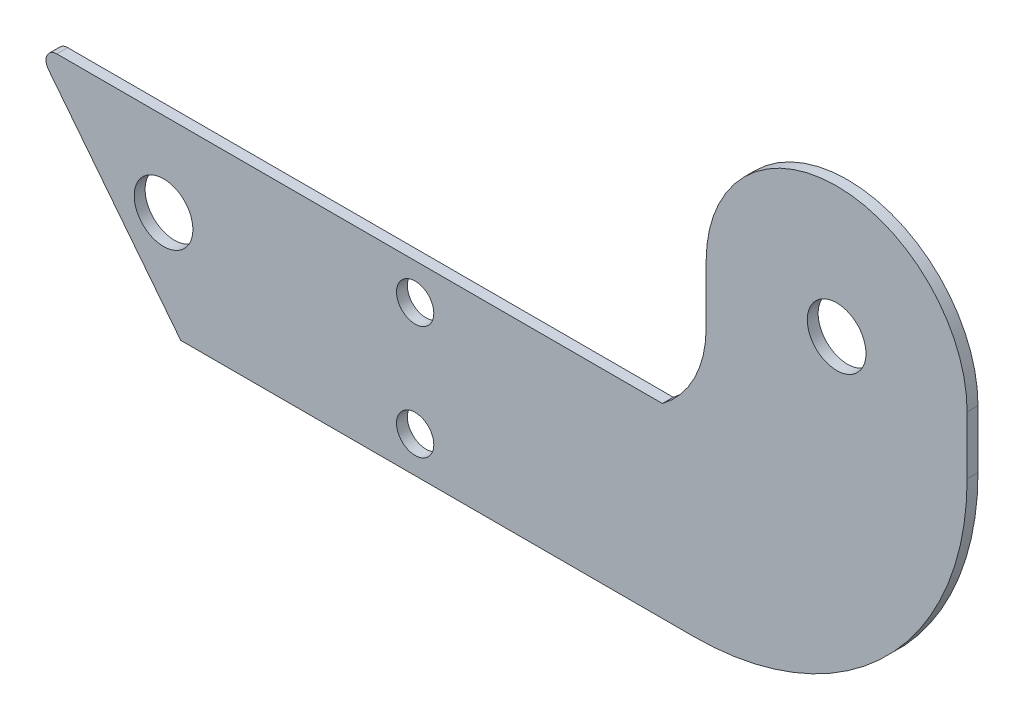
ISO-10303-21;
HEADER;
FILE_DESCRIPTION(('STEP AP214'),'2;1');
FILE_NAME('part.step','',(''),(''),'','','');
FILE_SCHEMA(('AUTOMOTIVE_DESIGN { 1 0 10303 214 1 1 1 1 }'));
ENDSEC;
DATA;
#1=APPLICATION_CONTEXT('core data for automotive mechanical design processes');
#2=APPLICATION_PROTOCOL_DEFINITION('international standard','automotive_design',2000,#1);
#3=PRODUCT_CONTEXT('',#1,'mechanical');
#4=PRODUCT('Part','Part','',(#3));
#5=PRODUCT_RELATED_PRODUCT_CATEGORY('part','',(#4));
#6=PRODUCT_DEFINITION_FORMATION('','',#4);
#7=PRODUCT_DEFINITION_CONTEXT('part definition',#1,'design');
#8=PRODUCT_DEFINITION('design','',#6,#7);
#9=PRODUCT_DEFINITION_SHAPE('','',#8);
#10=(LENGTH_UNIT() NAMED_UNIT(*) SI_UNIT(.MILLI.,.METRE.));
#11=(NAMED_UNIT(*) PLANE_ANGLE_UNIT() SI_UNIT($,.RADIAN.));
#12=(NAMED_UNIT(*) SI_UNIT($,.STERADIAN.) SOLID_ANGLE_UNIT());
#13=UNCERTAINTY_MEASURE_WITH_UNIT(LENGTH_MEASURE(1.E-05),#10,'distance_accuracy_value','');
#14=(GEOMETRIC_REPRESENTATION_CONTEXT(3) GLOBAL_UNCERTAINTY_ASSIGNED_CONTEXT((#13)) GLOBAL_UNIT_ASSIGNED_CONTEXT((#10,
#11,#12)) REPRESENTATION_CONTEXT('',''));
#15=CARTESIAN_POINT('',(0.,0.,0.));
#16=DIRECTION('',(0.,0.,1.));
#17=DIRECTION('',(1.,0.,0.));
#18=AXIS2_PLACEMENT_3D('',#15,#16,#17);
#19=CARTESIAN_POINT('',(0.,0.,1.5));
#20=DIRECTION('',(0.,0.,1.));
#21=DIRECTION('',(1.,0.,0.));
#22=AXIS2_PLACEMENT_3D('',#19,#20,#21);
#23=PLANE('',#22);
#24=CARTESIAN_POINT('',(-58.195334887504,-25.0276954441722,1.5));
#25=DIRECTION('',(0.,0.,1.));
#26=DIRECTION('',(1.,0.,0.));
#27=AXIS2_PLACEMENT_3D('',#24,#25,#26);
#28=CIRCLE('',#27,2.57408060153384);
#29=CARTESIAN_POINT('',(-55.6212542859701,-25.0276954441722,1.5));
#30=VERTEX_POINT('',#29);
#31=EDGE_CURVE('E220',#30,#30,#28,.T.);
#32=ORIENTED_EDGE('',*,*,#31,.F.);
#33=EDGE_LOOP('',(#32));
#34=FACE_BOUND('',#33,.T.);
#35=CARTESIAN_POINT('',(0.,0.,1.5));
#36=DIRECTION('',(0.,0.,1.));
#37=DIRECTION('',(1.,0.,0.));
#38=AXIS2_PLACEMENT_3D('',#35,#36,#37);
#39=CIRCLE('',#38,4.05);
#40=CARTESIAN_POINT('',(4.05,0.,1.5));
#41=VERTEX_POINT('',#40);
#42=EDGE_CURVE('E191',#41,#41,#39,.T.);
#43=ORIENTED_EDGE('',*,*,#42,.F.);
#44=EDGE_LOOP('',(#43));
#45=FACE_BOUND('',#44,.T.);
#46=DIRECTION('',(-1.,0.,0.));
#47=VECTOR('',#46,1.);
#48=CARTESIAN_POINT('',(-24.0556103281021,-20.0276954441722,1.5));
#49=LINE('',#48,#47);
#50=CARTESIAN_POINT('',(-24.0556103281021,-20.0276954441722,1.5));
#51=VERTEX_POINT('',#50);
#52=CARTESIAN_POINT('',(-107.666093549766,-20.0276954441722,1.5));
#53=VERTEX_POINT('',#52);
#54=EDGE_CURVE('E203',#51,#53,#49,.T.);
#55=ORIENTED_EDGE('',*,*,#54,.T.);
#56=CARTESIAN_POINT('',(-107.666093549766,-21.5276954441722,1.5));
#57=DIRECTION('',(0.,0.,1.));
#58=DIRECTION('',(1.,0.,0.));
#59=AXIS2_PLACEMENT_3D('',#56,#57,#58);
#60=CIRCLE('',#59,1.5);
#61=CARTESIAN_POINT('',(-108.845780500913,-22.4541611463397,1.5));
#62=VERTEX_POINT('',#61);
#63=EDGE_CURVE('E11',#53,#62,#60,.T.);
#64=ORIENTED_EDGE('',*,*,#63,.T.);
#65=DIRECTION('',(0.617643801444985,-0.786457967431565,0.));
#66=VECTOR('',#65,1.);
#67=CARTESIAN_POINT('',(-110.751402368102,-20.0276954441722,1.5));
#68=LINE('',#67,#66);
#69=CARTESIAN_POINT('',(-90.5636264688089,-45.733186478937,1.5));
#70=VERTEX_POINT('',#69);
#71=EDGE_CURVE('E200',#62,#70,#68,.T.);
#72=ORIENTED_EDGE('',*,*,#71,.T.);
#73=DIRECTION('',(1.,0.,0.));
#74=VECTOR('',#73,1.);
#75=CARTESIAN_POINT('',(-19.7146222682,-45.733186478937,1.5));
#76=LINE('',#75,#74);
#77=CARTESIAN_POINT('',(-19.7146222682,-45.733186478937,1.5));
#78=VERTEX_POINT('',#77);
#79=EDGE_CURVE('E197',#70,#78,#76,.T.);
#80=ORIENTED_EDGE('',*,*,#79,.T.);
#81=CARTESIAN_POINT('',(-19.7146222682001,-7.99999999999998,1.5));
#82=DIRECTION('',(0.,0.,1.));
#83=DIRECTION('',(-1.,0.,0.));
#84=AXIS2_PLACEMENT_3D('',#81,#82,#83);
#85=CIRCLE('',#84,37.733186478937);
#86=CARTESIAN_POINT('',(18.018564210737,-7.99999999999997,1.5));
#87=VERTEX_POINT('',#86);
#88=EDGE_CURVE('E194',#78,#87,#85,.T.);
#89=ORIENTED_EDGE('',*,*,#88,.T.);
#90=DIRECTION('',(0.,1.,0.));
#91=VECTOR('',#90,1.);
#92=CARTESIAN_POINT('',(18.018564210737,0.,1.5));
#93=LINE('',#92,#91);
#94=CARTESIAN_POINT('',(18.018564210737,0.,1.5));
#95=VERTEX_POINT('',#94);
#96=EDGE_CURVE('E128',#87,#95,#93,.T.);
#97=ORIENTED_EDGE('',*,*,#96,.T.);
#98=CARTESIAN_POINT('',(0.,0.,1.5));
#99=DIRECTION('',(0.,0.,1.));
#100=DIRECTION('',(1.,0.,0.));
#101=AXIS2_PLACEMENT_3D('',#98,#99,#100);
#102=CIRCLE('',#101,18.018564210737);
#103=CARTESIAN_POINT('',(-18.018564210737,0.,1.5));
#104=VERTEX_POINT('',#103);
#105=EDGE_CURVE('E123',#95,#104,#102,.T.);
#106=ORIENTED_EDGE('',*,*,#105,.T.);
#107=DIRECTION('',(0.,-1.,0.));
#108=VECTOR('',#107,1.);
#109=CARTESIAN_POINT('',(-18.018564210737,0.,1.5));
#110=LINE('',#109,#108);
#111=CARTESIAN_POINT('',(-18.018564210737,-8.,1.5));
#112=VERTEX_POINT('',#111);
#113=EDGE_CURVE('E111',#104,#112,#110,.T.);
#114=ORIENTED_EDGE('',*,*,#113,.T.);
#115=CARTESIAN_POINT('',(-33.018564210737,-8.,1.5));
#116=DIRECTION('',(0.,0.,-1.));
#117=DIRECTION('',(-1.,0.,0.));
#118=AXIS2_PLACEMENT_3D('',#115,#116,#117);
#119=CIRCLE('',#118,15.);
#120=EDGE_CURVE('E122',#112,#51,#119,.T.);
#121=ORIENTED_EDGE('',*,*,#120,.T.);
#122=EDGE_LOOP('',(#55,#64,#72,#80,#89,#97,#106,#114,#121));
#123=FACE_BOUND('',#122,.T.);
#124=CARTESIAN_POINT('',(-58.195334887504,-40.733186478937,1.5));
#125=DIRECTION('',(0.,0.,1.));
#126=DIRECTION('',(1.,0.,0.));
#127=AXIS2_PLACEMENT_3D('',#124,#125,#126);
#128=CIRCLE('',#127,2.57408060153384);
#129=CARTESIAN_POINT('',(-55.6212542859701,-40.733186478937,1.5));
#130=VERTEX_POINT('',#129);
#131=EDGE_CURVE('E212',#130,#130,#128,.T.);
#132=ORIENTED_EDGE('',*,*,#131,.F.);
#133=EDGE_LOOP('',(#132));
#134=FACE_BOUND('',#133,.T.);
#135=CARTESIAN_POINT('',(-92.9350455121701,-31.6398290440086,1.5));
#136=DIRECTION('',(0.,0.,1.));
#137=DIRECTION('',(1.,0.,0.));
#138=AXIS2_PLACEMENT_3D('',#135,#136,#137);
#139=CIRCLE('',#138,4.05);
#140=CARTESIAN_POINT('',(-88.8850455121701,-31.6398290440086,1.5));
#141=VERTEX_POINT('',#140);
#142=EDGE_CURVE('E228',#141,#141,#139,.T.);
#143=ORIENTED_EDGE('',*,*,#142,.F.);
#144=EDGE_LOOP('',(#143));
#145=FACE_BOUND('',#144,.T.);
#146=ADVANCED_FACE('F39',(#34,#45,#123,#134,#145),#23,.T.);
#147=CARTESIAN_POINT('',(0.,0.,0.));
#148=DIRECTION('',(0.,0.,1.));
#149=DIRECTION('',(1.,0.,0.));
#150=AXIS2_PLACEMENT_3D('',#147,#148,#149);
#151=PLANE('',#150);
#152=DIRECTION('',(0.617643801444985,-0.786457967431565,0.));
#153=VECTOR('',#152,1.);
#154=CARTESIAN_POINT('',(-110.751402368102,-20.0276954441722,0.));
#155=LINE('',#154,#153);
#156=CARTESIAN_POINT('',(-108.845780500913,-22.4541611463397,0.));
#157=VERTEX_POINT('',#156);
#158=CARTESIAN_POINT('',(-90.5636264688089,-45.733186478937,0.));
#159=VERTEX_POINT('',#158);
#160=EDGE_CURVE('E177',#157,#159,#155,.T.);
#161=ORIENTED_EDGE('',*,*,#160,.F.);
#162=CARTESIAN_POINT('',(-107.666093549766,-21.5276954441722,0.));
#163=DIRECTION('',(0.,0.,1.));
#164=DIRECTION('',(1.,0.,0.));
#165=AXIS2_PLACEMENT_3D('',#162,#163,#164);
#166=CIRCLE('',#165,1.5);
#167=CARTESIAN_POINT('',(-107.666093549766,-20.0276954441722,0.));
#168=VERTEX_POINT('',#167);
#169=EDGE_CURVE('E62',#157,#168,#166,.F.);
#170=ORIENTED_EDGE('',*,*,#169,.T.);
#171=DIRECTION('',(-1.,0.,0.));
#172=VECTOR('',#171,1.);
#173=CARTESIAN_POINT('',(-24.0556103281021,-20.0276954441722,0.));
#174=LINE('',#173,#172);
#175=CARTESIAN_POINT('',(-24.0556103281021,-20.0276954441722,0.));
#176=VERTEX_POINT('',#175);
#177=EDGE_CURVE('E180',#176,#168,#174,.T.);
#178=ORIENTED_EDGE('',*,*,#177,.F.);
#179=CARTESIAN_POINT('',(-33.018564210737,-8.,0.));
#180=DIRECTION('',(0.,0.,-1.));
#181=DIRECTION('',(-1.,0.,0.));
#182=AXIS2_PLACEMENT_3D('',#179,#180,#181);
#183=CIRCLE('',#182,15.);
#184=CARTESIAN_POINT('',(-18.018564210737,-8.,0.));
#185=VERTEX_POINT('',#184);
#186=EDGE_CURVE('E183',#185,#176,#183,.T.);
#187=ORIENTED_EDGE('',*,*,#186,.F.);
#188=DIRECTION('',(0.,-1.,0.));
#189=VECTOR('',#188,1.);
#190=CARTESIAN_POINT('',(-18.018564210737,0.,0.));
#191=LINE('',#190,#189);
#192=CARTESIAN_POINT('',(-18.018564210737,0.,0.));
#193=VERTEX_POINT('',#192);
#194=EDGE_CURVE('E186',#193,#185,#191,.T.);
#195=ORIENTED_EDGE('',*,*,#194,.F.);
#196=CARTESIAN_POINT('',(0.,0.,0.));
#197=DIRECTION('',(0.,0.,1.));
#198=DIRECTION('',(1.,0.,0.));
#199=AXIS2_PLACEMENT_3D('',#196,#197,#198);
#200=CIRCLE('',#199,18.018564210737);
#201=CARTESIAN_POINT('',(18.018564210737,0.,0.));
#202=VERTEX_POINT('',#201);
#203=EDGE_CURVE('E137',#202,#193,#200,.T.);
#204=ORIENTED_EDGE('',*,*,#203,.F.);
#205=DIRECTION('',(0.,1.,0.));
#206=VECTOR('',#205,1.);
#207=CARTESIAN_POINT('',(18.018564210737,0.,0.));
#208=LINE('',#207,#206);
#209=CARTESIAN_POINT('',(18.018564210737,-7.99999999999997,0.));
#210=VERTEX_POINT('',#209);
#211=EDGE_CURVE('E133',#210,#202,#208,.T.);
#212=ORIENTED_EDGE('',*,*,#211,.F.);
#213=CARTESIAN_POINT('',(-19.7146222682001,-7.99999999999998,0.));
#214=DIRECTION('',(0.,0.,1.));
#215=DIRECTION('',(-1.,0.,0.));
#216=AXIS2_PLACEMENT_3D('',#213,#214,#215);
#217=CIRCLE('',#216,37.733186478937);
#218=CARTESIAN_POINT('',(-19.7146222682,-45.733186478937,0.));
#219=VERTEX_POINT('',#218);
#220=EDGE_CURVE('E171',#219,#210,#217,.T.);
#221=ORIENTED_EDGE('',*,*,#220,.F.);
#222=DIRECTION('',(1.,0.,0.));
#223=VECTOR('',#222,1.);
#224=CARTESIAN_POINT('',(-19.7146222682,-45.733186478937,0.));
#225=LINE('',#224,#223);
#226=EDGE_CURVE('E174',#159,#219,#225,.T.);
#227=ORIENTED_EDGE('',*,*,#226,.F.);
#228=EDGE_LOOP('',(#161,#170,#178,#187,#195,#204,#212,#221,#227));
#229=FACE_BOUND('',#228,.T.);
#230=CARTESIAN_POINT('',(0.,0.,0.));
#231=DIRECTION('',(0.,0.,1.));
#232=DIRECTION('',(1.,0.,0.));
#233=AXIS2_PLACEMENT_3D('',#230,#231,#232);
#234=CIRCLE('',#233,4.05);
#235=CARTESIAN_POINT('',(4.05,0.,0.));
#236=VERTEX_POINT('',#235);
#237=EDGE_CURVE('E208',#236,#236,#234,.T.);
#238=ORIENTED_EDGE('',*,*,#237,.T.);
#239=EDGE_LOOP('',(#238));
#240=FACE_BOUND('',#239,.T.);
#241=CARTESIAN_POINT('',(-58.195334887504,-40.733186478937,0.));
#242=DIRECTION('',(0.,0.,1.));
#243=DIRECTION('',(1.,0.,0.));
#244=AXIS2_PLACEMENT_3D('',#241,#242,#243);
#245=CIRCLE('',#244,2.57408060153384);
#246=CARTESIAN_POINT('',(-55.6212542859701,-40.733186478937,0.));
#247=VERTEX_POINT('',#246);
#248=EDGE_CURVE('E216',#247,#247,#245,.T.);
#249=ORIENTED_EDGE('',*,*,#248,.T.);
#250=EDGE_LOOP('',(#249));
#251=FACE_BOUND('',#250,.T.);
#252=CARTESIAN_POINT('',(-58.195334887504,-25.0276954441722,0.));
#253=DIRECTION('',(0.,0.,1.));
#254=DIRECTION('',(1.,0.,0.));
#255=AXIS2_PLACEMENT_3D('',#252,#253,#254);
#256=CIRCLE('',#255,2.57408060153384);
#257=CARTESIAN_POINT('',(-55.6212542859701,-25.0276954441722,0.));
#258=VERTEX_POINT('',#257);
#259=EDGE_CURVE('E224',#258,#258,#256,.T.);
#260=ORIENTED_EDGE('',*,*,#259,.T.);
#261=EDGE_LOOP('',(#260));
#262=FACE_BOUND('',#261,.T.);
#263=CARTESIAN_POINT('',(-92.9350455121701,-31.6398290440086,0.));
#264=DIRECTION('',(0.,0.,1.));
#265=DIRECTION('',(1.,0.,0.));
#266=AXIS2_PLACEMENT_3D('',#263,#264,#265);
#267=CIRCLE('',#266,4.05);
#268=CARTESIAN_POINT('',(-88.8850455121701,-31.6398290440086,0.));
#269=VERTEX_POINT('',#268);
#270=EDGE_CURVE('E232',#269,#269,#267,.T.);
#271=ORIENTED_EDGE('',*,*,#270,.T.);
#272=EDGE_LOOP('',(#271));
#273=FACE_BOUND('',#272,.T.);
#274=ADVANCED_FACE('F244',(#229,#240,#251,#262,#273),#151,.F.);
#275=CARTESIAN_POINT('',(0.,0.,1.5));
#276=DIRECTION('',(0.,0.,-1.));
#277=DIRECTION('',(-1.,0.,0.));
#278=AXIS2_PLACEMENT_3D('',#275,#276,#277);
#279=CYLINDRICAL_SURFACE('',#278,18.018564210737);
#280=ORIENTED_EDGE('',*,*,#203,.T.);
#281=DIRECTION('',(0.,0.,-1.));
#282=VECTOR('',#281,1.);
#283=CARTESIAN_POINT('',(-18.018564210737,0.,1.5));
#284=LINE('',#283,#282);
#285=EDGE_CURVE('E115',#104,#193,#284,.T.);
#286=ORIENTED_EDGE('',*,*,#285,.F.);
#287=ORIENTED_EDGE('',*,*,#105,.F.);
#288=DIRECTION('',(0.,0.,-1.));
#289=VECTOR('',#288,1.);
#290=CARTESIAN_POINT('',(18.018564210737,0.,1.5));
#291=LINE('',#290,#289);
#292=EDGE_CURVE('E166',#95,#202,#291,.T.);
#293=ORIENTED_EDGE('',*,*,#292,.T.);
#294=EDGE_LOOP('',(#280,#286,#287,#293));
#295=FACE_BOUND('',#294,.T.);
#296=ADVANCED_FACE('F135',(#295),#279,.T.);
#297=CARTESIAN_POINT('',(-18.018564210737,0.,1.5));
#298=DIRECTION('',(1.,0.,0.));
#299=DIRECTION('',(0.,0.,-1.));
#300=AXIS2_PLACEMENT_3D('',#297,#298,#299);
#301=PLANE('',#300);
#302=ORIENTED_EDGE('',*,*,#194,.T.);
#303=DIRECTION('',(0.,0.,-1.));
#304=VECTOR('',#303,1.);
#305=CARTESIAN_POINT('',(-18.018564210737,-8.,1.5));
#306=LINE('',#305,#304);
#307=EDGE_CURVE('E118',#112,#185,#306,.T.);
#308=ORIENTED_EDGE('',*,*,#307,.F.);
#309=ORIENTED_EDGE('',*,*,#113,.F.);
#310=ORIENTED_EDGE('',*,*,#285,.T.);
#311=EDGE_LOOP('',(#302,#308,#309,#310));
#312=FACE_BOUND('',#311,.T.);
#313=ADVANCED_FACE('F113',(#312),#301,.F.);
#314=CARTESIAN_POINT('',(-33.018564210737,-8.,1.5));
#315=DIRECTION('',(0.,0.,-1.));
#316=DIRECTION('',(-1.,0.,0.));
#317=AXIS2_PLACEMENT_3D('',#314,#315,#316);
#318=CYLINDRICAL_SURFACE('',#317,15.);
#319=ORIENTED_EDGE('',*,*,#186,.T.);
#320=DIRECTION('',(0.,0.,-1.));
#321=VECTOR('',#320,1.);
#322=CARTESIAN_POINT('',(-24.0556103281021,-20.0276954441722,1.5));
#323=LINE('',#322,#321);
#324=EDGE_CURVE('E145',#51,#176,#323,.T.);
#325=ORIENTED_EDGE('',*,*,#324,.F.);
#326=ORIENTED_EDGE('',*,*,#120,.F.);
#327=ORIENTED_EDGE('',*,*,#307,.T.);
#328=EDGE_LOOP('',(#319,#325,#326,#327));
#329=FACE_BOUND('',#328,.T.);
#330=ADVANCED_FACE('F276',(#329),#318,.F.);
#331=CARTESIAN_POINT('',(-24.0556103281021,-20.0276954441722,1.5));
#332=DIRECTION('',(0.,-1.,0.));
#333=DIRECTION('',(1.,0.,0.));
#334=AXIS2_PLACEMENT_3D('',#331,#332,#333);
#335=PLANE('',#334);
#336=ORIENTED_EDGE('',*,*,#177,.T.);
#337=DIRECTION('',(0.,0.,-1.));
#338=VECTOR('',#337,1.);
#339=CARTESIAN_POINT('',(-107.666093549766,-20.0276954441722,1.5));
#340=LINE('',#339,#338);
#341=EDGE_CURVE('E48',#168,#53,#340,.F.);
#342=ORIENTED_EDGE('',*,*,#341,.T.);
#343=ORIENTED_EDGE('',*,*,#54,.F.);
#344=ORIENTED_EDGE('',*,*,#324,.T.);
#345=EDGE_LOOP('',(#336,#342,#343,#344));
#346=FACE_BOUND('',#345,.T.);
#347=ADVANCED_FACE('F272',(#346),#335,.F.);
#348=CARTESIAN_POINT('',(-110.751402368102,-20.0276954441722,1.5));
#349=DIRECTION('',(0.786457967431565,0.617643801444985,0.));
#350=DIRECTION('',(-0.617643801444985,0.786457967431565,0.));
#351=AXIS2_PLACEMENT_3D('',#348,#349,#350);
#352=PLANE('',#351);
#353=ORIENTED_EDGE('',*,*,#71,.F.);
#354=DIRECTION('',(0.,0.,-1.));
#355=VECTOR('',#354,1.);
#356=CARTESIAN_POINT('',(-108.845780500913,-22.4541611463397,1.5));
#357=LINE('',#356,#355);
#358=EDGE_CURVE('E139',#62,#157,#357,.T.);
#359=ORIENTED_EDGE('',*,*,#358,.T.);
#360=ORIENTED_EDGE('',*,*,#160,.T.);
#361=DIRECTION('',(0.,0.,-1.));
#362=VECTOR('',#361,1.);
#363=CARTESIAN_POINT('',(-90.5636264688089,-45.733186478937,1.5));
#364=LINE('',#363,#362);
#365=EDGE_CURVE('E154',#70,#159,#364,.T.);
#366=ORIENTED_EDGE('',*,*,#365,.F.);
#367=EDGE_LOOP('',(#353,#359,#360,#366));
#368=FACE_BOUND('',#367,.T.);
#369=ADVANCED_FACE('F268',(#368),#352,.F.);
#370=CARTESIAN_POINT('',(-19.7146222682,-45.733186478937,1.5));
#371=DIRECTION('',(0.,1.,0.));
#372=DIRECTION('',(-1.,0.,0.));
#373=AXIS2_PLACEMENT_3D('',#370,#371,#372);
#374=PLANE('',#373);
#375=ORIENTED_EDGE('',*,*,#226,.T.);
#376=DIRECTION('',(0.,0.,-1.));
#377=VECTOR('',#376,1.);
#378=CARTESIAN_POINT('',(-19.7146222682,-45.733186478937,1.5));
#379=LINE('',#378,#377);
#380=EDGE_CURVE('E158',#78,#219,#379,.T.);
#381=ORIENTED_EDGE('',*,*,#380,.F.);
#382=ORIENTED_EDGE('',*,*,#79,.F.);
#383=ORIENTED_EDGE('',*,*,#365,.T.);
#384=EDGE_LOOP('',(#375,#381,#382,#383));
#385=FACE_BOUND('',#384,.T.);
#386=ADVANCED_FACE('F264',(#385),#374,.F.);
#387=CARTESIAN_POINT('',(-19.7146222682001,-7.99999999999998,1.5));
#388=DIRECTION('',(0.,0.,-1.));
#389=DIRECTION('',(-1.,0.,0.));
#390=AXIS2_PLACEMENT_3D('',#387,#388,#389);
#391=CYLINDRICAL_SURFACE('',#390,37.733186478937);
#392=ORIENTED_EDGE('',*,*,#220,.T.);
#393=DIRECTION('',(0.,0.,-1.));
#394=VECTOR('',#393,1.);
#395=CARTESIAN_POINT('',(18.018564210737,-7.99999999999997,1.5));
#396=LINE('',#395,#394);
#397=EDGE_CURVE('E162',#87,#210,#396,.T.);
#398=ORIENTED_EDGE('',*,*,#397,.F.);
#399=ORIENTED_EDGE('',*,*,#88,.F.);
#400=ORIENTED_EDGE('',*,*,#380,.T.);
#401=EDGE_LOOP('',(#392,#398,#399,#400));
#402=FACE_BOUND('',#401,.T.);
#403=ADVANCED_FACE('F260',(#402),#391,.T.);
#404=CARTESIAN_POINT('',(18.018564210737,0.,1.5));
#405=DIRECTION('',(-1.,0.,0.));
#406=DIRECTION('',(0.,-1.,0.));
#407=AXIS2_PLACEMENT_3D('',#404,#405,#406);
#408=PLANE('',#407);
#409=ORIENTED_EDGE('',*,*,#211,.T.);
#410=ORIENTED_EDGE('',*,*,#292,.F.);
#411=ORIENTED_EDGE('',*,*,#96,.F.);
#412=ORIENTED_EDGE('',*,*,#397,.T.);
#413=EDGE_LOOP('',(#409,#410,#411,#412));
#414=FACE_BOUND('',#413,.T.);
#415=ADVANCED_FACE('F257',(#414),#408,.F.);
#416=CARTESIAN_POINT('',(0.,0.,1.5));
#417=DIRECTION('',(0.,0.,-1.));
#418=DIRECTION('',(-1.,0.,0.));
#419=AXIS2_PLACEMENT_3D('',#416,#417,#418);
#420=CYLINDRICAL_SURFACE('',#419,4.05);
#421=ORIENTED_EDGE('',*,*,#42,.T.);
#422=EDGE_LOOP('',(#421));
#423=FACE_BOUND('',#422,.T.);
#424=ORIENTED_EDGE('',*,*,#237,.F.);
#425=EDGE_LOOP('',(#424));
#426=FACE_BOUND('',#425,.T.);
#427=ADVANCED_FACE('F254',(#423,#426),#420,.F.);
#428=CARTESIAN_POINT('',(-58.195334887504,-40.733186478937,1.5));
#429=DIRECTION('',(0.,0.,-1.));
#430=DIRECTION('',(-1.,0.,0.));
#431=AXIS2_PLACEMENT_3D('',#428,#429,#430);
#432=CYLINDRICAL_SURFACE('',#431,2.57408060153384);
#433=ORIENTED_EDGE('',*,*,#131,.T.);
#434=EDGE_LOOP('',(#433));
#435=FACE_BOUND('',#434,.T.);
#436=ORIENTED_EDGE('',*,*,#248,.F.);
#437=EDGE_LOOP('',(#436));
#438=FACE_BOUND('',#437,.T.);
#439=ADVANCED_FACE('F321',(#435,#438),#432,.F.);
#440=CARTESIAN_POINT('',(-58.195334887504,-25.0276954441722,1.5));
#441=DIRECTION('',(0.,0.,-1.));
#442=DIRECTION('',(-1.,0.,0.));
#443=AXIS2_PLACEMENT_3D('',#440,#441,#442);
#444=CYLINDRICAL_SURFACE('',#443,2.57408060153384);
#445=ORIENTED_EDGE('',*,*,#31,.T.);
#446=EDGE_LOOP('',(#445));
#447=FACE_BOUND('',#446,.T.);
#448=ORIENTED_EDGE('',*,*,#259,.F.);
#449=EDGE_LOOP('',(#448));
#450=FACE_BOUND('',#449,.T.);
#451=ADVANCED_FACE('F328',(#447,#450),#444,.F.);
#452=CARTESIAN_POINT('',(-92.9350455121701,-31.6398290440086,1.5));
#453=DIRECTION('',(0.,0.,-1.));
#454=DIRECTION('',(-1.,0.,0.));
#455=AXIS2_PLACEMENT_3D('',#452,#453,#454);
#456=CYLINDRICAL_SURFACE('',#455,4.05);
#457=ORIENTED_EDGE('',*,*,#142,.T.);
#458=EDGE_LOOP('',(#457));
#459=FACE_BOUND('',#458,.T.);
#460=ORIENTED_EDGE('',*,*,#270,.F.);
#461=EDGE_LOOP('',(#460));
#462=FACE_BOUND('',#461,.T.);
#463=ADVANCED_FACE('F240',(#459,#462),#456,.F.);
#464=CARTESIAN_POINT('',(-107.666093549766,-21.5276954441722,1.5));
#465=DIRECTION('',(0.,0.,-1.));
#466=DIRECTION('',(-1.,0.,0.));
#467=AXIS2_PLACEMENT_3D('',#464,#465,#466);
#468=CYLINDRICAL_SURFACE('',#467,1.5);
#469=ORIENTED_EDGE('',*,*,#63,.F.);
#470=ORIENTED_EDGE('',*,*,#341,.F.);
#471=ORIENTED_EDGE('',*,*,#169,.F.);
#472=ORIENTED_EDGE('',*,*,#358,.F.);
#473=EDGE_LOOP('',(#469,#470,#471,#472));
#474=FACE_BOUND('',#473,.T.);
#475=ADVANCED_FACE('F41',(#474),#468,.T.);
#476=CLOSED_SHELL('',(#146,#274,#296,#313,#330,#347,#369,#386,#403,#415,#427,#439,#451,#463,#475));
#477=MANIFOLD_SOLID_BREP('B2',#476);
#478=ADVANCED_BREP_SHAPE_REPRESENTATION('',(#18,#477),#14);
#479=SHAPE_DEFINITION_REPRESENTATION(#9,#478);
ENDSEC;
END-ISO-10303-21;
